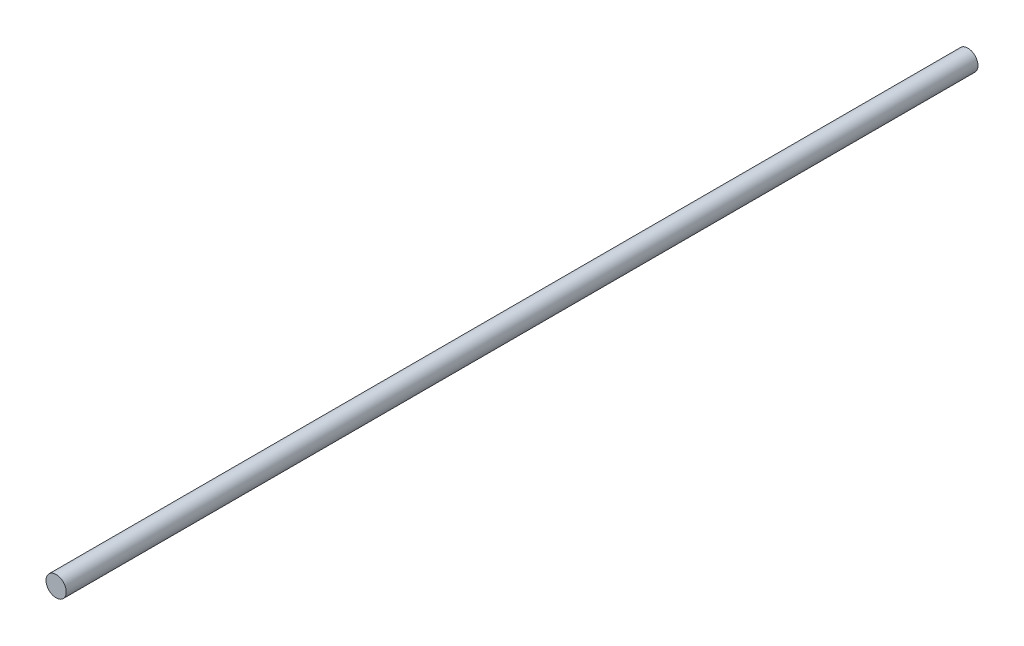
ISO-10303-21;
HEADER;
FILE_DESCRIPTION(('STEP AP214'),'2;1');
FILE_NAME('part.step','',(''),(''),'','','');
FILE_SCHEMA(('AUTOMOTIVE_DESIGN { 1 0 10303 214 1 1 1 1 }'));
ENDSEC;
DATA;
#1=APPLICATION_CONTEXT('core data for automotive mechanical design processes');
#2=APPLICATION_PROTOCOL_DEFINITION('international standard','automotive_design',2000,#1);
#3=PRODUCT_CONTEXT('',#1,'mechanical');
#4=PRODUCT('Part','Part','',(#3));
#5=PRODUCT_RELATED_PRODUCT_CATEGORY('part','',(#4));
#6=PRODUCT_DEFINITION_FORMATION('','',#4);
#7=PRODUCT_DEFINITION_CONTEXT('part definition',#1,'design');
#8=PRODUCT_DEFINITION('design','',#6,#7);
#9=PRODUCT_DEFINITION_SHAPE('','',#8);
#10=(LENGTH_UNIT() NAMED_UNIT(*) SI_UNIT(.MILLI.,.METRE.));
#11=(NAMED_UNIT(*) PLANE_ANGLE_UNIT() SI_UNIT($,.RADIAN.));
#12=(NAMED_UNIT(*) SI_UNIT($,.STERADIAN.) SOLID_ANGLE_UNIT());
#13=UNCERTAINTY_MEASURE_WITH_UNIT(LENGTH_MEASURE(1.E-05),#10,'distance_accuracy_value','');
#14=(GEOMETRIC_REPRESENTATION_CONTEXT(3) GLOBAL_UNCERTAINTY_ASSIGNED_CONTEXT((#13)) GLOBAL_UNIT_ASSIGNED_CONTEXT((#10,
#11,#12)) REPRESENTATION_CONTEXT('',''));
#15=CARTESIAN_POINT('',(0.,0.,0.));
#16=DIRECTION('',(0.,0.,1.));
#17=DIRECTION('',(1.,0.,0.));
#18=AXIS2_PLACEMENT_3D('',#15,#16,#17);
#19=CARTESIAN_POINT('',(0.,0.,900.));
#20=DIRECTION('',(0.,0.,-1.));
#21=DIRECTION('',(-1.,0.,0.));
#22=AXIS2_PLACEMENT_3D('',#19,#20,#21);
#23=CYLINDRICAL_SURFACE('',#22,10.);
#24=CARTESIAN_POINT('',(0.,0.,900.));
#25=DIRECTION('',(0.,0.,1.));
#26=DIRECTION('',(1.,0.,0.));
#27=AXIS2_PLACEMENT_3D('',#24,#25,#26);
#28=CIRCLE('',#27,10.);
#29=CARTESIAN_POINT('',(10.,0.,900.));
#30=VERTEX_POINT('',#29);
#31=EDGE_CURVE('E10',#30,#30,#28,.T.);
#32=ORIENTED_EDGE('',*,*,#31,.F.);
#33=EDGE_LOOP('',(#32));
#34=FACE_BOUND('',#33,.T.);
#35=CARTESIAN_POINT('',(0.,0.,0.));
#36=DIRECTION('',(0.,0.,1.));
#37=DIRECTION('',(1.,0.,0.));
#38=AXIS2_PLACEMENT_3D('',#35,#36,#37);
#39=CIRCLE('',#38,10.);
#40=CARTESIAN_POINT('',(10.,0.,0.));
#41=VERTEX_POINT('',#40);
#42=EDGE_CURVE('E35',#41,#41,#39,.T.);
#43=ORIENTED_EDGE('',*,*,#42,.T.);
#44=EDGE_LOOP('',(#43));
#45=FACE_BOUND('',#44,.T.);
#46=ADVANCED_FACE('F32',(#34,#45),#23,.T.);
#47=CARTESIAN_POINT('',(0.,0.,900.));
#48=DIRECTION('',(0.,0.,1.));
#49=DIRECTION('',(1.,0.,0.));
#50=AXIS2_PLACEMENT_3D('',#47,#48,#49);
#51=PLANE('',#50);
#52=ORIENTED_EDGE('',*,*,#31,.T.);
#53=EDGE_LOOP('',(#52));
#54=FACE_BOUND('',#53,.T.);
#55=ADVANCED_FACE('F47',(#54),#51,.T.);
#56=CARTESIAN_POINT('',(0.,0.,0.));
#57=DIRECTION('',(0.,0.,1.));
#58=DIRECTION('',(1.,0.,0.));
#59=AXIS2_PLACEMENT_3D('',#56,#57,#58);
#60=PLANE('',#59);
#61=ORIENTED_EDGE('',*,*,#42,.F.);
#62=EDGE_LOOP('',(#61));
#63=FACE_BOUND('',#62,.T.);
#64=ADVANCED_FACE('F45',(#63),#60,.F.);
#65=CLOSED_SHELL('',(#46,#55,#64));
#66=MANIFOLD_SOLID_BREP('B2',#65);
#67=ADVANCED_BREP_SHAPE_REPRESENTATION('',(#18,#66),#14);
#68=SHAPE_DEFINITION_REPRESENTATION(#9,#67);
ENDSEC;
END-ISO-10303-21;
